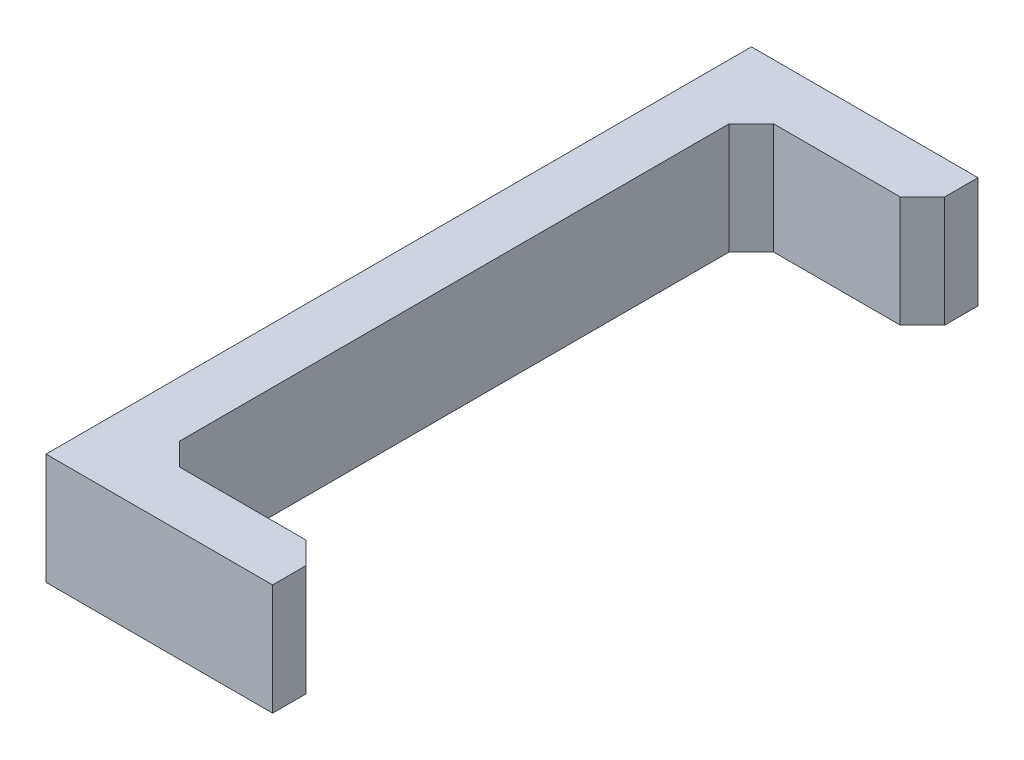
ISO-10303-21;
HEADER;
FILE_DESCRIPTION(('STEP AP214'),'2;1');
FILE_NAME('part.step','',(''),(''),'','','');
FILE_SCHEMA(('AUTOMOTIVE_DESIGN { 1 0 10303 214 1 1 1 1 }'));
ENDSEC;
DATA;
#1=APPLICATION_CONTEXT('core data for automotive mechanical design processes');
#2=APPLICATION_PROTOCOL_DEFINITION('international standard','automotive_design',2000,#1);
#3=PRODUCT_CONTEXT('',#1,'mechanical');
#4=PRODUCT('Part','Part','',(#3));
#5=PRODUCT_RELATED_PRODUCT_CATEGORY('part','',(#4));
#6=PRODUCT_DEFINITION_FORMATION('','',#4);
#7=PRODUCT_DEFINITION_CONTEXT('part definition',#1,'design');
#8=PRODUCT_DEFINITION('design','',#6,#7);
#9=PRODUCT_DEFINITION_SHAPE('','',#8);
#10=(LENGTH_UNIT() NAMED_UNIT(*) SI_UNIT(.MILLI.,.METRE.));
#11=(NAMED_UNIT(*) PLANE_ANGLE_UNIT() SI_UNIT($,.RADIAN.));
#12=(NAMED_UNIT(*) SI_UNIT($,.STERADIAN.) SOLID_ANGLE_UNIT());
#13=UNCERTAINTY_MEASURE_WITH_UNIT(LENGTH_MEASURE(1.E-05),#10,'distance_accuracy_value','');
#14=(GEOMETRIC_REPRESENTATION_CONTEXT(3) GLOBAL_UNCERTAINTY_ASSIGNED_CONTEXT((#13)) GLOBAL_UNIT_ASSIGNED_CONTEXT((#10,
#11,#12)) REPRESENTATION_CONTEXT('',''));
#15=CARTESIAN_POINT('',(0.,0.,0.));
#16=DIRECTION('',(0.,0.,1.));
#17=DIRECTION('',(1.,0.,0.));
#18=AXIS2_PLACEMENT_3D('',#15,#16,#17);
#19=CARTESIAN_POINT('',(-12.7,10.,31.75));
#20=DIRECTION('',(1.,0.,0.));
#21=DIRECTION('',(0.,0.,-1.));
#22=AXIS2_PLACEMENT_3D('',#19,#20,#21);
#23=PLANE('',#22);
#24=DIRECTION('',(0.,0.,1.));
#25=VECTOR('',#24,1.);
#26=CARTESIAN_POINT('',(-12.7,0.,31.75));
#27=LINE('',#26,#25);
#28=CARTESIAN_POINT('',(-12.7,0.,-31.75));
#29=VERTEX_POINT('',#28);
#30=CARTESIAN_POINT('',(-12.7,0.,31.75));
#31=VERTEX_POINT('',#30);
#32=EDGE_CURVE('E147',#29,#31,#27,.T.);
#33=ORIENTED_EDGE('',*,*,#32,.T.);
#34=DIRECTION('',(0.,-1.,0.));
#35=VECTOR('',#34,1.);
#36=CARTESIAN_POINT('',(-12.7,10.,31.75));
#37=LINE('',#36,#35);
#38=CARTESIAN_POINT('',(-12.7,10.,31.75));
#39=VERTEX_POINT('',#38);
#40=EDGE_CURVE('E127',#39,#31,#37,.T.);
#41=ORIENTED_EDGE('',*,*,#40,.F.);
#42=DIRECTION('',(0.,0.,1.));
#43=VECTOR('',#42,1.);
#44=CARTESIAN_POINT('',(-12.7,10.,31.75));
#45=LINE('',#44,#43);
#46=CARTESIAN_POINT('',(-12.7,10.,-31.75));
#47=VERTEX_POINT('',#46);
#48=EDGE_CURVE('E134',#47,#39,#45,.T.);
#49=ORIENTED_EDGE('',*,*,#48,.F.);
#50=DIRECTION('',(0.,-1.,0.));
#51=VECTOR('',#50,1.);
#52=CARTESIAN_POINT('',(-12.7,10.,-31.75));
#53=LINE('',#52,#51);
#54=EDGE_CURVE('E212',#47,#29,#53,.T.);
#55=ORIENTED_EDGE('',*,*,#54,.T.);
#56=EDGE_LOOP('',(#33,#41,#49,#55));
#57=FACE_BOUND('',#56,.T.);
#58=ADVANCED_FACE('F33',(#57),#23,.F.);
#59=CARTESIAN_POINT('',(7.7,10.,31.75));
#60=DIRECTION('',(0.,0.,-1.));
#61=DIRECTION('',(-1.,0.,0.));
#62=AXIS2_PLACEMENT_3D('',#59,#60,#61);
#63=PLANE('',#62);
#64=DIRECTION('',(1.,0.,0.));
#65=VECTOR('',#64,1.);
#66=CARTESIAN_POINT('',(7.7,0.,31.75));
#67=LINE('',#66,#65);
#68=CARTESIAN_POINT('',(7.7,0.,31.75));
#69=VERTEX_POINT('',#68);
#70=EDGE_CURVE('E214',#31,#69,#67,.T.);
#71=ORIENTED_EDGE('',*,*,#70,.T.);
#72=DIRECTION('',(0.,-1.,0.));
#73=VECTOR('',#72,1.);
#74=CARTESIAN_POINT('',(7.7,10.,31.75));
#75=LINE('',#74,#73);
#76=CARTESIAN_POINT('',(7.7,10.,31.75));
#77=VERTEX_POINT('',#76);
#78=EDGE_CURVE('E130',#77,#69,#75,.T.);
#79=ORIENTED_EDGE('',*,*,#78,.F.);
#80=DIRECTION('',(1.,0.,0.));
#81=VECTOR('',#80,1.);
#82=CARTESIAN_POINT('',(7.7,10.,31.75));
#83=LINE('',#82,#81);
#84=EDGE_CURVE('E123',#39,#77,#83,.T.);
#85=ORIENTED_EDGE('',*,*,#84,.F.);
#86=ORIENTED_EDGE('',*,*,#40,.T.);
#87=EDGE_LOOP('',(#71,#79,#85,#86));
#88=FACE_BOUND('',#87,.T.);
#89=ADVANCED_FACE('F125',(#88),#63,.F.);
#90=CARTESIAN_POINT('',(7.7,10.,26.75));
#91=DIRECTION('',(-1.,0.,0.));
#92=DIRECTION('',(0.,0.,1.));
#93=AXIS2_PLACEMENT_3D('',#90,#91,#92);
#94=PLANE('',#93);
#95=DIRECTION('',(0.,0.,-1.));
#96=VECTOR('',#95,1.);
#97=CARTESIAN_POINT('',(7.7,0.,26.75));
#98=LINE('',#97,#96);
#99=CARTESIAN_POINT('',(7.7,0.,28.75));
#100=VERTEX_POINT('',#99);
#101=EDGE_CURVE('E216',#69,#100,#98,.T.);
#102=ORIENTED_EDGE('',*,*,#101,.T.);
#103=DIRECTION('',(0.,1.,0.));
#104=VECTOR('',#103,1.);
#105=CARTESIAN_POINT('',(7.7,10.,28.75));
#106=LINE('',#105,#104);
#107=CARTESIAN_POINT('',(7.7,10.,28.75));
#108=VERTEX_POINT('',#107);
#109=EDGE_CURVE('E174',#100,#108,#106,.T.);
#110=ORIENTED_EDGE('',*,*,#109,.T.);
#111=DIRECTION('',(0.,0.,-1.));
#112=VECTOR('',#111,1.);
#113=CARTESIAN_POINT('',(7.7,10.,26.75));
#114=LINE('',#113,#112);
#115=EDGE_CURVE('E133',#77,#108,#114,.T.);
#116=ORIENTED_EDGE('',*,*,#115,.F.);
#117=ORIENTED_EDGE('',*,*,#78,.T.);
#118=EDGE_LOOP('',(#102,#110,#116,#117));
#119=FACE_BOUND('',#118,.T.);
#120=ADVANCED_FACE('F234',(#119),#94,.F.);
#121=CARTESIAN_POINT('',(7.7,10.,26.75));
#122=DIRECTION('',(0.,0.,1.));
#123=DIRECTION('',(1.,0.,0.));
#124=AXIS2_PLACEMENT_3D('',#121,#122,#123);
#125=PLANE('',#124);
#126=DIRECTION('',(-1.,0.,0.));
#127=VECTOR('',#126,1.);
#128=CARTESIAN_POINT('',(7.7,10.,26.75));
#129=LINE('',#128,#127);
#130=CARTESIAN_POINT('',(5.7,10.,26.75));
#131=VERTEX_POINT('',#130);
#132=CARTESIAN_POINT('',(-5.70000000000001,10.,26.75));
#133=VERTEX_POINT('',#132);
#134=EDGE_CURVE('E207',#131,#133,#129,.T.);
#135=ORIENTED_EDGE('',*,*,#134,.F.);
#136=DIRECTION('',(0.,-1.,0.));
#137=VECTOR('',#136,1.);
#138=CARTESIAN_POINT('',(5.69999999999999,10.,26.75));
#139=LINE('',#138,#137);
#140=CARTESIAN_POINT('',(5.69999999999999,0.,26.75));
#141=VERTEX_POINT('',#140);
#142=EDGE_CURVE('E171',#131,#141,#139,.T.);
#143=ORIENTED_EDGE('',*,*,#142,.T.);
#144=DIRECTION('',(-1.,0.,0.));
#145=VECTOR('',#144,1.);
#146=CARTESIAN_POINT('',(7.7,0.,26.75));
#147=LINE('',#146,#145);
#148=CARTESIAN_POINT('',(-5.70000000000001,0.,26.75));
#149=VERTEX_POINT('',#148);
#150=EDGE_CURVE('E194',#141,#149,#147,.T.);
#151=ORIENTED_EDGE('',*,*,#150,.T.);
#152=DIRECTION('',(0.,1.,0.));
#153=VECTOR('',#152,1.);
#154=CARTESIAN_POINT('',(-5.70000000000001,10.,26.75));
#155=LINE('',#154,#153);
#156=EDGE_CURVE('E169',#149,#133,#155,.T.);
#157=ORIENTED_EDGE('',*,*,#156,.T.);
#158=EDGE_LOOP('',(#135,#143,#151,#157));
#159=FACE_BOUND('',#158,.T.);
#160=ADVANCED_FACE('F245',(#159),#125,.F.);
#161=CARTESIAN_POINT('',(-7.7,10.,26.75));
#162=DIRECTION('',(-1.,0.,0.));
#163=DIRECTION('',(0.,0.,1.));
#164=AXIS2_PLACEMENT_3D('',#161,#162,#163);
#165=PLANE('',#164);
#166=DIRECTION('',(0.,0.,-1.));
#167=VECTOR('',#166,1.);
#168=CARTESIAN_POINT('',(-7.7,10.,26.75));
#169=LINE('',#168,#167);
#170=CARTESIAN_POINT('',(-7.7,10.,24.75));
#171=VERTEX_POINT('',#170);
#172=CARTESIAN_POINT('',(-7.7,10.,-24.75));
#173=VERTEX_POINT('',#172);
#174=EDGE_CURVE('E200',#171,#173,#169,.T.);
#175=ORIENTED_EDGE('',*,*,#174,.F.);
#176=DIRECTION('',(0.,-1.,0.));
#177=VECTOR('',#176,1.);
#178=CARTESIAN_POINT('',(-7.7,0.,24.75));
#179=LINE('',#178,#177);
#180=CARTESIAN_POINT('',(-7.7,0.,24.75));
#181=VERTEX_POINT('',#180);
#182=EDGE_CURVE('E177',#171,#181,#179,.T.);
#183=ORIENTED_EDGE('',*,*,#182,.T.);
#184=DIRECTION('',(0.,0.,-1.));
#185=VECTOR('',#184,1.);
#186=CARTESIAN_POINT('',(-7.7,0.,26.75));
#187=LINE('',#186,#185);
#188=CARTESIAN_POINT('',(-7.7,0.,-24.75));
#189=VERTEX_POINT('',#188);
#190=EDGE_CURVE('E187',#181,#189,#187,.T.);
#191=ORIENTED_EDGE('',*,*,#190,.T.);
#192=DIRECTION('',(0.,1.,0.));
#193=VECTOR('',#192,1.);
#194=CARTESIAN_POINT('',(-7.7,10.,-24.75));
#195=LINE('',#194,#193);
#196=EDGE_CURVE('E48',#189,#173,#195,.T.);
#197=ORIENTED_EDGE('',*,*,#196,.T.);
#198=EDGE_LOOP('',(#175,#183,#191,#197));
#199=FACE_BOUND('',#198,.T.);
#200=ADVANCED_FACE('F192',(#199),#165,.F.);
#201=CARTESIAN_POINT('',(7.7,10.,-26.75));
#202=DIRECTION('',(0.,0.,-1.));
#203=DIRECTION('',(-1.,0.,0.));
#204=AXIS2_PLACEMENT_3D('',#201,#202,#203);
#205=PLANE('',#204);
#206=DIRECTION('',(1.,0.,0.));
#207=VECTOR('',#206,1.);
#208=CARTESIAN_POINT('',(7.7,0.,-26.75));
#209=LINE('',#208,#207);
#210=CARTESIAN_POINT('',(-5.69999999999998,0.,-26.75));
#211=VERTEX_POINT('',#210);
#212=CARTESIAN_POINT('',(5.69999999999998,0.,-26.75));
#213=VERTEX_POINT('',#212);
#214=EDGE_CURVE('E189',#211,#213,#209,.T.);
#215=ORIENTED_EDGE('',*,*,#214,.T.);
#216=DIRECTION('',(0.,1.,0.));
#217=VECTOR('',#216,1.);
#218=CARTESIAN_POINT('',(5.69999999999998,10.,-26.75));
#219=LINE('',#218,#217);
#220=CARTESIAN_POINT('',(5.7,10.,-26.75));
#221=VERTEX_POINT('',#220);
#222=EDGE_CURVE('E163',#213,#221,#219,.T.);
#223=ORIENTED_EDGE('',*,*,#222,.T.);
#224=DIRECTION('',(1.,0.,0.));
#225=VECTOR('',#224,1.);
#226=CARTESIAN_POINT('',(7.7,10.,-26.75));
#227=LINE('',#226,#225);
#228=CARTESIAN_POINT('',(-5.69999999999998,10.,-26.75));
#229=VERTEX_POINT('',#228);
#230=EDGE_CURVE('E198',#229,#221,#227,.T.);
#231=ORIENTED_EDGE('',*,*,#230,.F.);
#232=DIRECTION('',(0.,-1.,0.));
#233=VECTOR('',#232,1.);
#234=CARTESIAN_POINT('',(-5.69999999999998,0.,-26.75));
#235=LINE('',#234,#233);
#236=EDGE_CURVE('E160',#229,#211,#235,.T.);
#237=ORIENTED_EDGE('',*,*,#236,.T.);
#238=EDGE_LOOP('',(#215,#223,#231,#237));
#239=FACE_BOUND('',#238,.T.);
#240=ADVANCED_FACE('F202',(#239),#205,.F.);
#241=CARTESIAN_POINT('',(7.7,10.,-31.75));
#242=DIRECTION('',(-1.,0.,0.));
#243=DIRECTION('',(0.,0.,1.));
#244=AXIS2_PLACEMENT_3D('',#241,#242,#243);
#245=PLANE('',#244);
#246=DIRECTION('',(0.,0.,-1.));
#247=VECTOR('',#246,1.);
#248=CARTESIAN_POINT('',(7.7,10.,-31.75));
#249=LINE('',#248,#247);
#250=CARTESIAN_POINT('',(7.7,10.,-28.75));
#251=VERTEX_POINT('',#250);
#252=CARTESIAN_POINT('',(7.7,10.,-31.75));
#253=VERTEX_POINT('',#252);
#254=EDGE_CURVE('E204',#251,#253,#249,.T.);
#255=ORIENTED_EDGE('',*,*,#254,.F.);
#256=DIRECTION('',(0.,-1.,0.));
#257=VECTOR('',#256,1.);
#258=CARTESIAN_POINT('',(7.7,10.,-28.75));
#259=LINE('',#258,#257);
#260=CARTESIAN_POINT('',(7.7,0.,-28.75));
#261=VERTEX_POINT('',#260);
#262=EDGE_CURVE('E148',#251,#261,#259,.T.);
#263=ORIENTED_EDGE('',*,*,#262,.T.);
#264=DIRECTION('',(0.,0.,-1.));
#265=VECTOR('',#264,1.);
#266=CARTESIAN_POINT('',(7.7,0.,-31.75));
#267=LINE('',#266,#265);
#268=CARTESIAN_POINT('',(7.7,0.,-31.75));
#269=VERTEX_POINT('',#268);
#270=EDGE_CURVE('E222',#261,#269,#267,.T.);
#271=ORIENTED_EDGE('',*,*,#270,.T.);
#272=DIRECTION('',(0.,-1.,0.));
#273=VECTOR('',#272,1.);
#274=CARTESIAN_POINT('',(7.7,10.,-31.75));
#275=LINE('',#274,#273);
#276=EDGE_CURVE('E153',#253,#269,#275,.T.);
#277=ORIENTED_EDGE('',*,*,#276,.F.);
#278=EDGE_LOOP('',(#255,#263,#271,#277));
#279=FACE_BOUND('',#278,.T.);
#280=ADVANCED_FACE('F272',(#279),#245,.F.);
#281=CARTESIAN_POINT('',(7.7,10.,-31.75));
#282=DIRECTION('',(0.,0.,1.));
#283=DIRECTION('',(1.,0.,0.));
#284=AXIS2_PLACEMENT_3D('',#281,#282,#283);
#285=PLANE('',#284);
#286=DIRECTION('',(-1.,0.,0.));
#287=VECTOR('',#286,1.);
#288=CARTESIAN_POINT('',(7.7,0.,-31.75));
#289=LINE('',#288,#287);
#290=EDGE_CURVE('E144',#269,#29,#289,.T.);
#291=ORIENTED_EDGE('',*,*,#290,.T.);
#292=ORIENTED_EDGE('',*,*,#54,.F.);
#293=DIRECTION('',(-1.,0.,0.));
#294=VECTOR('',#293,1.);
#295=CARTESIAN_POINT('',(7.7,10.,-31.75));
#296=LINE('',#295,#294);
#297=EDGE_CURVE('E140',#253,#47,#296,.T.);
#298=ORIENTED_EDGE('',*,*,#297,.F.);
#299=ORIENTED_EDGE('',*,*,#276,.T.);
#300=EDGE_LOOP('',(#291,#292,#298,#299));
#301=FACE_BOUND('',#300,.T.);
#302=ADVANCED_FACE('F229',(#301),#285,.F.);
#303=CARTESIAN_POINT('',(0.,10.,0.));
#304=DIRECTION('',(0.,1.,0.));
#305=DIRECTION('',(0.,0.,1.));
#306=AXIS2_PLACEMENT_3D('',#303,#304,#305);
#307=PLANE('',#306);
#308=ORIENTED_EDGE('',*,*,#230,.T.);
#309=DIRECTION('',(-0.707106781186549,0.,0.707106781186546));
#310=VECTOR('',#309,1.);
#311=CARTESIAN_POINT('',(-10.525,10.,-10.5250000000001));
#312=LINE('',#311,#310);
#313=EDGE_CURVE('E167',#221,#251,#312,.F.);
#314=ORIENTED_EDGE('',*,*,#313,.T.);
#315=ORIENTED_EDGE('',*,*,#254,.T.);
#316=ORIENTED_EDGE('',*,*,#297,.T.);
#317=ORIENTED_EDGE('',*,*,#48,.T.);
#318=ORIENTED_EDGE('',*,*,#84,.T.);
#319=ORIENTED_EDGE('',*,*,#115,.T.);
#320=DIRECTION('',(0.707106781186546,0.,0.707106781186549));
#321=VECTOR('',#320,1.);
#322=CARTESIAN_POINT('',(-10.525,10.,10.525));
#323=LINE('',#322,#321);
#324=EDGE_CURVE('E165',#108,#131,#323,.F.);
#325=ORIENTED_EDGE('',*,*,#324,.T.);
#326=ORIENTED_EDGE('',*,*,#134,.T.);
#327=DIRECTION('',(0.707106781186543,0.,0.707106781186552));
#328=VECTOR('',#327,1.);
#329=CARTESIAN_POINT('',(-7.7,10.,24.75));
#330=LINE('',#329,#328);
#331=EDGE_CURVE('E55',#133,#171,#330,.F.);
#332=ORIENTED_EDGE('',*,*,#331,.T.);
#333=ORIENTED_EDGE('',*,*,#174,.T.);
#334=DIRECTION('',(-0.707106781186552,0.,0.707106781186543));
#335=VECTOR('',#334,1.);
#336=CARTESIAN_POINT('',(-5.69999999999998,10.,-26.75));
#337=LINE('',#336,#335);
#338=EDGE_CURVE('E11',#173,#229,#337,.F.);
#339=ORIENTED_EDGE('',*,*,#338,.T.);
#340=EDGE_LOOP('',(#308,#314,#315,#316,#317,#318,#319,#325,#326,#332,#333,#339));
#341=FACE_BOUND('',#340,.T.);
#342=ADVANCED_FACE('F138',(#341),#307,.T.);
#343=CARTESIAN_POINT('',(0.,0.,0.));
#344=DIRECTION('',(0.,1.,0.));
#345=DIRECTION('',(0.,0.,1.));
#346=AXIS2_PLACEMENT_3D('',#343,#344,#345);
#347=PLANE('',#346);
#348=ORIENTED_EDGE('',*,*,#270,.F.);
#349=DIRECTION('',(0.707106781186549,0.,-0.707106781186546));
#350=VECTOR('',#349,1.);
#351=CARTESIAN_POINT('',(7.7,0.,-28.75));
#352=LINE('',#351,#350);
#353=EDGE_CURVE('E158',#261,#213,#352,.F.);
#354=ORIENTED_EDGE('',*,*,#353,.T.);
#355=ORIENTED_EDGE('',*,*,#214,.F.);
#356=DIRECTION('',(0.707106781186552,0.,-0.707106781186543));
#357=VECTOR('',#356,1.);
#358=CARTESIAN_POINT('',(-16.2249999999999,0.,-16.2250000000002));
#359=LINE('',#358,#357);
#360=EDGE_CURVE('E41',#211,#189,#359,.F.);
#361=ORIENTED_EDGE('',*,*,#360,.T.);
#362=ORIENTED_EDGE('',*,*,#190,.F.);
#363=DIRECTION('',(-0.707106781186543,0.,-0.707106781186552));
#364=VECTOR('',#363,1.);
#365=CARTESIAN_POINT('',(-16.225,0.,16.2249999999998));
#366=LINE('',#365,#364);
#367=EDGE_CURVE('E180',#181,#149,#366,.F.);
#368=ORIENTED_EDGE('',*,*,#367,.T.);
#369=ORIENTED_EDGE('',*,*,#150,.F.);
#370=DIRECTION('',(-0.707106781186546,0.,-0.707106781186549));
#371=VECTOR('',#370,1.);
#372=CARTESIAN_POINT('',(5.69999999999999,0.,26.75));
#373=LINE('',#372,#371);
#374=EDGE_CURVE('E151',#141,#100,#373,.F.);
#375=ORIENTED_EDGE('',*,*,#374,.T.);
#376=ORIENTED_EDGE('',*,*,#101,.F.);
#377=ORIENTED_EDGE('',*,*,#70,.F.);
#378=ORIENTED_EDGE('',*,*,#32,.F.);
#379=ORIENTED_EDGE('',*,*,#290,.F.);
#380=EDGE_LOOP('',(#348,#354,#355,#361,#362,#368,#369,#375,#376,#377,#378,#379));
#381=FACE_BOUND('',#380,.T.);
#382=ADVANCED_FACE('F186',(#381),#347,.F.);
#383=CARTESIAN_POINT('',(7.7,10.,-28.75));
#384=DIRECTION('',(-0.707106781186546,0.,-0.707106781186549));
#385=DIRECTION('',(0.,-1.,0.));
#386=AXIS2_PLACEMENT_3D('',#383,#384,#385);
#387=PLANE('',#386);
#388=ORIENTED_EDGE('',*,*,#313,.F.);
#389=ORIENTED_EDGE('',*,*,#222,.F.);
#390=ORIENTED_EDGE('',*,*,#353,.F.);
#391=ORIENTED_EDGE('',*,*,#262,.F.);
#392=EDGE_LOOP('',(#388,#389,#390,#391));
#393=FACE_BOUND('',#392,.T.);
#394=ADVANCED_FACE('F249',(#393),#387,.F.);
#395=CARTESIAN_POINT('',(5.69999999999999,10.,26.75));
#396=DIRECTION('',(-0.707106781186549,0.,0.707106781186546));
#397=DIRECTION('',(0.,-1.,0.));
#398=AXIS2_PLACEMENT_3D('',#395,#396,#397);
#399=PLANE('',#398);
#400=ORIENTED_EDGE('',*,*,#324,.F.);
#401=ORIENTED_EDGE('',*,*,#109,.F.);
#402=ORIENTED_EDGE('',*,*,#374,.F.);
#403=ORIENTED_EDGE('',*,*,#142,.F.);
#404=EDGE_LOOP('',(#400,#401,#402,#403));
#405=FACE_BOUND('',#404,.T.);
#406=ADVANCED_FACE('F247',(#405),#399,.F.);
#407=CARTESIAN_POINT('',(-7.7,10.,24.75));
#408=DIRECTION('',(0.707106781186552,0.,-0.707106781186543));
#409=DIRECTION('',(0.,1.,0.));
#410=AXIS2_PLACEMENT_3D('',#407,#408,#409);
#411=PLANE('',#410);
#412=ORIENTED_EDGE('',*,*,#331,.F.);
#413=ORIENTED_EDGE('',*,*,#156,.F.);
#414=ORIENTED_EDGE('',*,*,#367,.F.);
#415=ORIENTED_EDGE('',*,*,#182,.F.);
#416=EDGE_LOOP('',(#412,#413,#414,#415));
#417=FACE_BOUND('',#416,.T.);
#418=ADVANCED_FACE('F243',(#417),#411,.T.);
#419=CARTESIAN_POINT('',(-5.69999999999998,10.,-26.75));
#420=DIRECTION('',(0.707106781186543,0.,0.707106781186552));
#421=DIRECTION('',(0.,1.,0.));
#422=AXIS2_PLACEMENT_3D('',#419,#420,#421);
#423=PLANE('',#422);
#424=ORIENTED_EDGE('',*,*,#338,.F.);
#425=ORIENTED_EDGE('',*,*,#196,.F.);
#426=ORIENTED_EDGE('',*,*,#360,.F.);
#427=ORIENTED_EDGE('',*,*,#236,.F.);
#428=EDGE_LOOP('',(#424,#425,#426,#427));
#429=FACE_BOUND('',#428,.T.);
#430=ADVANCED_FACE('F35',(#429),#423,.T.);
#431=CLOSED_SHELL('',(#58,#89,#120,#160,#200,#240,#280,#302,#342,#382,#394,#406,#418,#430));
#432=MANIFOLD_SOLID_BREP('B2',#431);
#433=ADVANCED_BREP_SHAPE_REPRESENTATION('',(#18,#432),#14);
#434=SHAPE_DEFINITION_REPRESENTATION(#9,#433);
ENDSEC;
END-ISO-10303-21;
